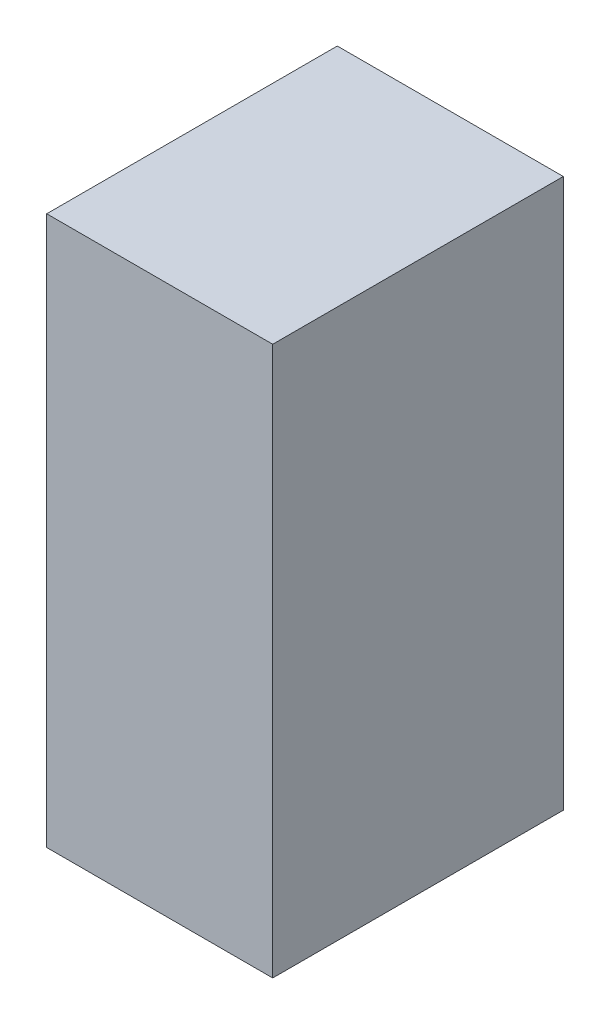
ISO-10303-21;
HEADER;
FILE_DESCRIPTION(('STEP AP214'),'2;1');
FILE_NAME('part.step','',(''),(''),'','','');
FILE_SCHEMA(('AUTOMOTIVE_DESIGN { 1 0 10303 214 1 1 1 1 }'));
ENDSEC;
DATA;
#1=APPLICATION_CONTEXT('core data for automotive mechanical design processes');
#2=APPLICATION_PROTOCOL_DEFINITION('international standard','automotive_design',2000,#1);
#3=PRODUCT_CONTEXT('',#1,'mechanical');
#4=PRODUCT('Part','Part','',(#3));
#5=PRODUCT_RELATED_PRODUCT_CATEGORY('part','',(#4));
#6=PRODUCT_DEFINITION_FORMATION('','',#4);
#7=PRODUCT_DEFINITION_CONTEXT('part definition',#1,'design');
#8=PRODUCT_DEFINITION('design','',#6,#7);
#9=PRODUCT_DEFINITION_SHAPE('','',#8);
#10=(LENGTH_UNIT() NAMED_UNIT(*) SI_UNIT(.MILLI.,.METRE.));
#11=(NAMED_UNIT(*) PLANE_ANGLE_UNIT() SI_UNIT($,.RADIAN.));
#12=(NAMED_UNIT(*) SI_UNIT($,.STERADIAN.) SOLID_ANGLE_UNIT());
#13=UNCERTAINTY_MEASURE_WITH_UNIT(LENGTH_MEASURE(1.E-05),#10,'distance_accuracy_value','');
#14=(GEOMETRIC_REPRESENTATION_CONTEXT(3) GLOBAL_UNCERTAINTY_ASSIGNED_CONTEXT((#13)) GLOBAL_UNIT_ASSIGNED_CONTEXT((#10,
#11,#12)) REPRESENTATION_CONTEXT('',''));
#15=CARTESIAN_POINT('',(0.,0.,0.));
#16=DIRECTION('',(0.,0.,1.));
#17=DIRECTION('',(1.,0.,0.));
#18=AXIS2_PLACEMENT_3D('',#15,#16,#17);
#19=CARTESIAN_POINT('',(-0.3499993,-0.85000084,0.));
#20=DIRECTION('',(-1.,0.,0.));
#21=DIRECTION('',(0.,0.,1.));
#22=AXIS2_PLACEMENT_3D('',#19,#20,#21);
#23=PLANE('',#22);
#24=DIRECTION('',(0.,0.,1.));
#25=VECTOR('',#24,1.);
#26=CARTESIAN_POINT('',(-0.3499993,0.85000084,0.));
#27=LINE('',#26,#25);
#28=CARTESIAN_POINT('',(-0.3499993,0.85000084,0.));
#29=VERTEX_POINT('',#28);
#30=CARTESIAN_POINT('',(-0.3499993,0.85000084,0.90000074));
#31=VERTEX_POINT('',#30);
#32=EDGE_CURVE('E18',#29,#31,#27,.T.);
#33=ORIENTED_EDGE('',*,*,#32,.F.);
#34=DIRECTION('',(0.,1.,0.));
#35=VECTOR('',#34,1.);
#36=CARTESIAN_POINT('',(-0.3499993,0.85000084,0.));
#37=LINE('',#36,#35);
#38=CARTESIAN_POINT('',(-0.3499993,-0.85000084,0.));
#39=VERTEX_POINT('',#38);
#40=EDGE_CURVE('E78',#29,#39,#37,.F.);
#41=ORIENTED_EDGE('',*,*,#40,.T.);
#42=DIRECTION('',(0.,0.,-1.));
#43=VECTOR('',#42,1.);
#44=CARTESIAN_POINT('',(-0.3499993,-0.85000084,0.));
#45=LINE('',#44,#43);
#46=CARTESIAN_POINT('',(-0.3499993,-0.85000084,0.90000074));
#47=VERTEX_POINT('',#46);
#48=EDGE_CURVE('E66',#47,#39,#45,.T.);
#49=ORIENTED_EDGE('',*,*,#48,.F.);
#50=DIRECTION('',(0.,1.,0.));
#51=VECTOR('',#50,1.);
#52=CARTESIAN_POINT('',(-0.3499993,0.85000084,0.90000074));
#53=LINE('',#52,#51);
#54=EDGE_CURVE('E54',#31,#47,#53,.F.);
#55=ORIENTED_EDGE('',*,*,#54,.F.);
#56=EDGE_LOOP('',(#33,#41,#49,#55));
#57=FACE_BOUND('',#56,.T.);
#58=ADVANCED_FACE('F15',(#57),#23,.T.);
#59=CARTESIAN_POINT('',(-0.3499993,0.85000084,0.));
#60=DIRECTION('',(0.,1.,0.));
#61=DIRECTION('',(0.,0.,1.));
#62=AXIS2_PLACEMENT_3D('',#59,#60,#61);
#63=PLANE('',#62);
#64=DIRECTION('',(0.,0.,-1.));
#65=VECTOR('',#64,1.);
#66=CARTESIAN_POINT('',(0.35000184,0.85000084,0.));
#67=LINE('',#66,#65);
#68=CARTESIAN_POINT('',(0.35000184,0.85000084,0.));
#69=VERTEX_POINT('',#68);
#70=CARTESIAN_POINT('',(0.35000184,0.85000084,0.90000074));
#71=VERTEX_POINT('',#70);
#72=EDGE_CURVE('E81',#69,#71,#67,.F.);
#73=ORIENTED_EDGE('',*,*,#72,.F.);
#74=DIRECTION('',(1.,0.,0.));
#75=VECTOR('',#74,1.);
#76=CARTESIAN_POINT('',(0.35000184,0.85000084,0.));
#77=LINE('',#76,#75);
#78=EDGE_CURVE('E63',#69,#29,#77,.F.);
#79=ORIENTED_EDGE('',*,*,#78,.T.);
#80=ORIENTED_EDGE('',*,*,#32,.T.);
#81=DIRECTION('',(1.,0.,0.));
#82=VECTOR('',#81,1.);
#83=CARTESIAN_POINT('',(0.35000184,0.85000084,0.90000074));
#84=LINE('',#83,#82);
#85=EDGE_CURVE('E60',#71,#31,#84,.F.);
#86=ORIENTED_EDGE('',*,*,#85,.F.);
#87=EDGE_LOOP('',(#73,#79,#80,#86));
#88=FACE_BOUND('',#87,.T.);
#89=ADVANCED_FACE('F59',(#88),#63,.T.);
#90=CARTESIAN_POINT('',(0.35000184,0.85000084,0.90000074));
#91=DIRECTION('',(0.,0.,1.));
#92=DIRECTION('',(1.,0.,0.));
#93=AXIS2_PLACEMENT_3D('',#90,#91,#92);
#94=PLANE('',#93);
#95=DIRECTION('',(1.,0.,0.));
#96=VECTOR('',#95,1.);
#97=CARTESIAN_POINT('',(0.35000184,-0.85000084,0.90000074));
#98=LINE('',#97,#96);
#99=CARTESIAN_POINT('',(0.35000184,-0.85000084,0.90000074));
#100=VERTEX_POINT('',#99);
#101=EDGE_CURVE('E68',#100,#47,#98,.F.);
#102=ORIENTED_EDGE('',*,*,#101,.F.);
#103=DIRECTION('',(0.,1.,0.));
#104=VECTOR('',#103,1.);
#105=CARTESIAN_POINT('',(0.35000184,0.85000084,0.90000074));
#106=LINE('',#105,#104);
#107=EDGE_CURVE('E72',#71,#100,#106,.F.);
#108=ORIENTED_EDGE('',*,*,#107,.F.);
#109=ORIENTED_EDGE('',*,*,#85,.T.);
#110=ORIENTED_EDGE('',*,*,#54,.T.);
#111=EDGE_LOOP('',(#102,#108,#109,#110));
#112=FACE_BOUND('',#111,.T.);
#113=ADVANCED_FACE('F70',(#112),#94,.T.);
#114=CARTESIAN_POINT('',(0.35000184,-0.85000084,0.));
#115=DIRECTION('',(0.,-1.,0.));
#116=DIRECTION('',(0.,0.,-1.));
#117=AXIS2_PLACEMENT_3D('',#114,#115,#116);
#118=PLANE('',#117);
#119=ORIENTED_EDGE('',*,*,#48,.T.);
#120=DIRECTION('',(1.,0.,0.));
#121=VECTOR('',#120,1.);
#122=CARTESIAN_POINT('',(0.35000184,-0.85000084,0.));
#123=LINE('',#122,#121);
#124=CARTESIAN_POINT('',(0.35000184,-0.85000084,0.));
#125=VERTEX_POINT('',#124);
#126=EDGE_CURVE('E33',#39,#125,#123,.T.);
#127=ORIENTED_EDGE('',*,*,#126,.T.);
#128=DIRECTION('',(0.,0.,-1.));
#129=VECTOR('',#128,1.);
#130=CARTESIAN_POINT('',(0.35000184,-0.85000084,0.));
#131=LINE('',#130,#129);
#132=EDGE_CURVE('E24',#100,#125,#131,.T.);
#133=ORIENTED_EDGE('',*,*,#132,.F.);
#134=ORIENTED_EDGE('',*,*,#101,.T.);
#135=EDGE_LOOP('',(#119,#127,#133,#134));
#136=FACE_BOUND('',#135,.T.);
#137=ADVANCED_FACE('F87',(#136),#118,.T.);
#138=CARTESIAN_POINT('',(0.35000184,0.85000084,0.));
#139=DIRECTION('',(0.,0.,1.));
#140=DIRECTION('',(1.,0.,0.));
#141=AXIS2_PLACEMENT_3D('',#138,#139,#140);
#142=PLANE('',#141);
#143=ORIENTED_EDGE('',*,*,#126,.F.);
#144=ORIENTED_EDGE('',*,*,#40,.F.);
#145=ORIENTED_EDGE('',*,*,#78,.F.);
#146=DIRECTION('',(0.,1.,0.));
#147=VECTOR('',#146,1.);
#148=CARTESIAN_POINT('',(0.35000184,0.85000084,0.));
#149=LINE('',#148,#147);
#150=EDGE_CURVE('E10',#125,#69,#149,.T.);
#151=ORIENTED_EDGE('',*,*,#150,.F.);
#152=EDGE_LOOP('',(#143,#144,#145,#151));
#153=FACE_BOUND('',#152,.T.);
#154=ADVANCED_FACE('F89',(#153),#142,.F.);
#155=CARTESIAN_POINT('',(0.35000184,0.85000084,0.));
#156=DIRECTION('',(1.,0.,0.));
#157=DIRECTION('',(0.,0.,-1.));
#158=AXIS2_PLACEMENT_3D('',#155,#156,#157);
#159=PLANE('',#158);
#160=ORIENTED_EDGE('',*,*,#132,.T.);
#161=ORIENTED_EDGE('',*,*,#150,.T.);
#162=ORIENTED_EDGE('',*,*,#72,.T.);
#163=ORIENTED_EDGE('',*,*,#107,.T.);
#164=EDGE_LOOP('',(#160,#161,#162,#163));
#165=FACE_BOUND('',#164,.T.);
#166=ADVANCED_FACE('F86',(#165),#159,.T.);
#167=CLOSED_SHELL('',(#58,#89,#113,#137,#154,#166));
#168=MANIFOLD_SOLID_BREP('B1',#167);
#169=ADVANCED_BREP_SHAPE_REPRESENTATION('',(#18,#168),#14);
#170=SHAPE_DEFINITION_REPRESENTATION(#9,#169);
ENDSEC;
END-ISO-10303-21;
